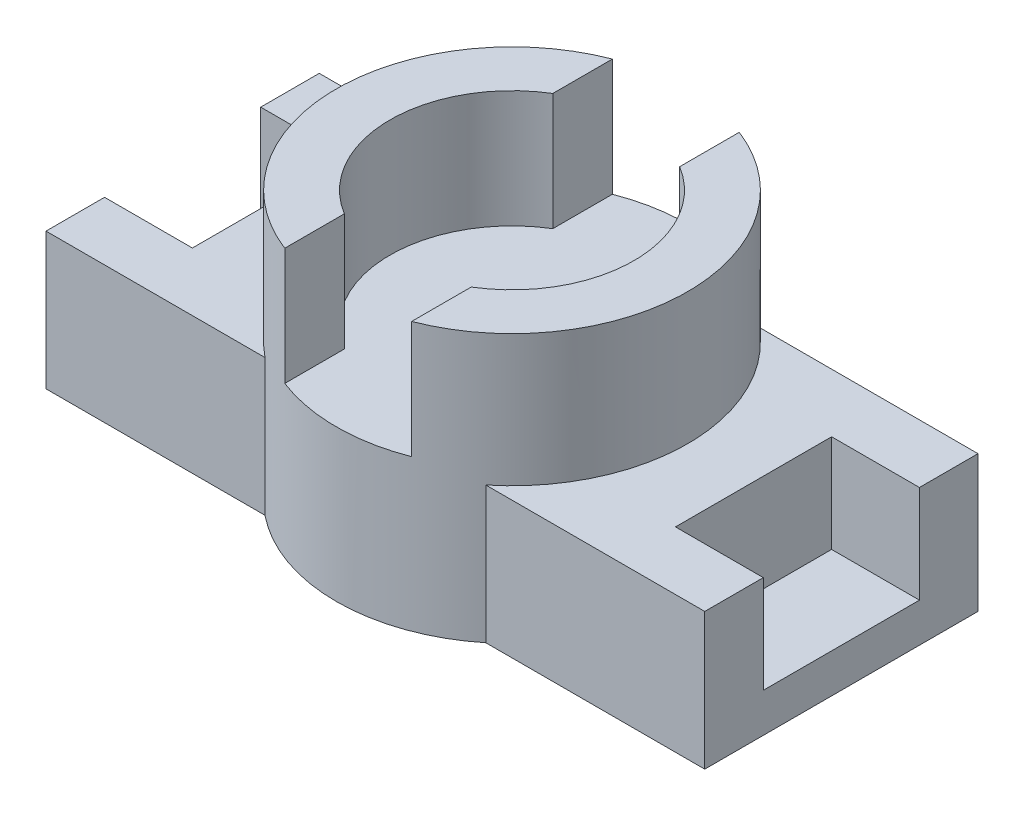
ISO-10303-21;
HEADER;
FILE_DESCRIPTION(('STEP AP214'),'2;1');
FILE_NAME('part.step','',(''),(''),'','','');
FILE_SCHEMA(('AUTOMOTIVE_DESIGN { 1 0 10303 214 1 1 1 1 }'));
ENDSEC;
DATA;
#1=APPLICATION_CONTEXT('core data for automotive mechanical design processes');
#2=APPLICATION_PROTOCOL_DEFINITION('international standard','automotive_design',2000,#1);
#3=PRODUCT_CONTEXT('',#1,'mechanical');
#4=PRODUCT('Part','Part','',(#3));
#5=PRODUCT_RELATED_PRODUCT_CATEGORY('part','',(#4));
#6=PRODUCT_DEFINITION_FORMATION('','',#4);
#7=PRODUCT_DEFINITION_CONTEXT('part definition',#1,'design');
#8=PRODUCT_DEFINITION('design','',#6,#7);
#9=PRODUCT_DEFINITION_SHAPE('','',#8);
#10=(LENGTH_UNIT() NAMED_UNIT(*) SI_UNIT(.MILLI.,.METRE.));
#11=(NAMED_UNIT(*) PLANE_ANGLE_UNIT() SI_UNIT($,.RADIAN.));
#12=(NAMED_UNIT(*) SI_UNIT($,.STERADIAN.) SOLID_ANGLE_UNIT());
#13=UNCERTAINTY_MEASURE_WITH_UNIT(LENGTH_MEASURE(1.E-05),#10,'distance_accuracy_value','');
#14=(GEOMETRIC_REPRESENTATION_CONTEXT(3) GLOBAL_UNCERTAINTY_ASSIGNED_CONTEXT((#13)) GLOBAL_UNIT_ASSIGNED_CONTEXT((#10,
#11,#12)) REPRESENTATION_CONTEXT('',''));
#15=CARTESIAN_POINT('',(0.,0.,0.));
#16=DIRECTION('',(0.,0.,1.));
#17=DIRECTION('',(1.,0.,0.));
#18=AXIS2_PLACEMENT_3D('',#15,#16,#17);
#19=CARTESIAN_POINT('',(0.,55.,0.));
#20=DIRECTION('',(0.,1.,0.));
#21=DIRECTION('',(0.,0.,1.));
#22=AXIS2_PLACEMENT_3D('',#19,#20,#21);
#23=PLANE('',#22);
#24=DIRECTION('',(0.,0.,-1.));
#25=VECTOR('',#24,1.);
#26=CARTESIAN_POINT('',(13.,55.,-33.570820663189));
#27=LINE('',#26,#25);
#28=CARTESIAN_POINT('',(13.,55.,-21.3541565040626));
#29=VERTEX_POINT('',#28);
#30=CARTESIAN_POINT('',(13.,55.,-33.570820663189));
#31=VERTEX_POINT('',#30);
#32=EDGE_CURVE('E212',#29,#31,#27,.T.);
#33=ORIENTED_EDGE('',*,*,#32,.F.);
#34=CARTESIAN_POINT('',(0.,55.,0.));
#35=DIRECTION('',(0.,1.,0.));
#36=DIRECTION('',(0.,0.,1.));
#37=AXIS2_PLACEMENT_3D('',#34,#35,#36);
#38=CIRCLE('',#37,25.);
#39=CARTESIAN_POINT('',(13.,55.,21.3541565040626));
#40=VERTEX_POINT('',#39);
#41=EDGE_CURVE('E402',#40,#29,#38,.T.);
#42=ORIENTED_EDGE('',*,*,#41,.F.);
#43=DIRECTION('',(0.,0.,-1.));
#44=VECTOR('',#43,1.);
#45=CARTESIAN_POINT('',(13.,55.,21.3541565040626));
#46=LINE('',#45,#44);
#47=CARTESIAN_POINT('',(13.,55.,33.570820663189));
#48=VERTEX_POINT('',#47);
#49=EDGE_CURVE('E399',#48,#40,#46,.T.);
#50=ORIENTED_EDGE('',*,*,#49,.F.);
#51=CARTESIAN_POINT('',(0.,55.,0.));
#52=DIRECTION('',(0.,1.,0.));
#53=DIRECTION('',(0.,0.,1.));
#54=AXIS2_PLACEMENT_3D('',#51,#52,#53);
#55=CIRCLE('',#54,36.);
#56=EDGE_CURVE('E282',#48,#31,#55,.T.);
#57=ORIENTED_EDGE('',*,*,#56,.T.);
#58=EDGE_LOOP('',(#33,#42,#50,#57));
#59=FACE_BOUND('',#58,.T.);
#60=ADVANCED_FACE('F33',(#59),#23,.T.);
#61=CARTESIAN_POINT('',(67.5,28.,28.));
#62=DIRECTION('',(-1.,0.,0.));
#63=DIRECTION('',(0.,0.,1.));
#64=AXIS2_PLACEMENT_3D('',#61,#62,#63);
#65=PLANE('',#64);
#66=DIRECTION('',(0.,1.,0.));
#67=VECTOR('',#66,1.);
#68=CARTESIAN_POINT('',(67.5,8.,16.));
#69=LINE('',#68,#67);
#70=CARTESIAN_POINT('',(67.5,8.,16.));
#71=VERTEX_POINT('',#70);
#72=CARTESIAN_POINT('',(67.5,28.,16.));
#73=VERTEX_POINT('',#72);
#74=EDGE_CURVE('E245',#71,#73,#69,.T.);
#75=ORIENTED_EDGE('',*,*,#74,.T.);
#76=DIRECTION('',(0.,0.,-1.));
#77=VECTOR('',#76,1.);
#78=CARTESIAN_POINT('',(67.5,28.,28.));
#79=LINE('',#78,#77);
#80=CARTESIAN_POINT('',(67.5,28.,28.));
#81=VERTEX_POINT('',#80);
#82=EDGE_CURVE('E305',#81,#73,#79,.T.);
#83=ORIENTED_EDGE('',*,*,#82,.F.);
#84=DIRECTION('',(0.,-1.,0.));
#85=VECTOR('',#84,1.);
#86=CARTESIAN_POINT('',(67.5,28.,28.));
#87=LINE('',#86,#85);
#88=CARTESIAN_POINT('',(67.5,0.,28.));
#89=VERTEX_POINT('',#88);
#90=EDGE_CURVE('E320',#81,#89,#87,.T.);
#91=ORIENTED_EDGE('',*,*,#90,.T.);
#92=DIRECTION('',(0.,0.,-1.));
#93=VECTOR('',#92,1.);
#94=CARTESIAN_POINT('',(67.5,0.,28.));
#95=LINE('',#94,#93);
#96=CARTESIAN_POINT('',(67.5,0.,-28.));
#97=VERTEX_POINT('',#96);
#98=EDGE_CURVE('E304',#89,#97,#95,.T.);
#99=ORIENTED_EDGE('',*,*,#98,.T.);
#100=DIRECTION('',(0.,-1.,0.));
#101=VECTOR('',#100,1.);
#102=CARTESIAN_POINT('',(67.5,28.,-28.));
#103=LINE('',#102,#101);
#104=CARTESIAN_POINT('',(67.5,28.,-28.));
#105=VERTEX_POINT('',#104);
#106=EDGE_CURVE('E11',#105,#97,#103,.T.);
#107=ORIENTED_EDGE('',*,*,#106,.F.);
#108=CARTESIAN_POINT('',(67.5,28.,-16.));
#109=VERTEX_POINT('',#108);
#110=EDGE_CURVE('E309',#109,#105,#79,.T.);
#111=ORIENTED_EDGE('',*,*,#110,.F.);
#112=DIRECTION('',(0.,1.,0.));
#113=VECTOR('',#112,1.);
#114=CARTESIAN_POINT('',(67.5,8.,-16.));
#115=LINE('',#114,#113);
#116=CARTESIAN_POINT('',(67.5,8.,-16.));
#117=VERTEX_POINT('',#116);
#118=EDGE_CURVE('E56',#117,#109,#115,.T.);
#119=ORIENTED_EDGE('',*,*,#118,.F.);
#120=DIRECTION('',(0.,0.,1.));
#121=VECTOR('',#120,1.);
#122=CARTESIAN_POINT('',(67.5,8.,16.));
#123=LINE('',#122,#121);
#124=EDGE_CURVE('E227',#117,#71,#123,.T.);
#125=ORIENTED_EDGE('',*,*,#124,.T.);
#126=EDGE_LOOP('',(#75,#83,#91,#99,#107,#111,#119,#125));
#127=FACE_BOUND('',#126,.T.);
#128=ADVANCED_FACE('F35',(#127),#65,.F.);
#129=CARTESIAN_POINT('',(0.,28.,0.));
#130=DIRECTION('',(0.,-1.,0.));
#131=DIRECTION('',(0.,0.,-1.));
#132=AXIS2_PLACEMENT_3D('',#129,#130,#131);
#133=PLANE('',#132);
#134=DIRECTION('',(-1.,0.,0.));
#135=VECTOR('',#134,1.);
#136=CARTESIAN_POINT('',(49.5,28.,16.));
#137=LINE('',#136,#135);
#138=CARTESIAN_POINT('',(49.5,28.,16.));
#139=VERTEX_POINT('',#138);
#140=EDGE_CURVE('E231',#73,#139,#137,.T.);
#141=ORIENTED_EDGE('',*,*,#140,.T.);
#142=DIRECTION('',(0.,0.,-1.));
#143=VECTOR('',#142,1.);
#144=CARTESIAN_POINT('',(49.5,28.,16.));
#145=LINE('',#144,#143);
#146=CARTESIAN_POINT('',(49.5,28.,-16.));
#147=VERTEX_POINT('',#146);
#148=EDGE_CURVE('E239',#139,#147,#145,.T.);
#149=ORIENTED_EDGE('',*,*,#148,.T.);
#150=DIRECTION('',(1.,0.,0.));
#151=VECTOR('',#150,1.);
#152=CARTESIAN_POINT('',(49.5,28.,-16.));
#153=LINE('',#152,#151);
#154=EDGE_CURVE('E237',#147,#109,#153,.T.);
#155=ORIENTED_EDGE('',*,*,#154,.T.);
#156=ORIENTED_EDGE('',*,*,#110,.T.);
#157=DIRECTION('',(-1.,0.,0.));
#158=VECTOR('',#157,1.);
#159=CARTESIAN_POINT('',(-67.5,28.,-28.));
#160=LINE('',#159,#158);
#161=CARTESIAN_POINT('',(22.6274169979695,28.,-28.));
#162=VERTEX_POINT('',#161);
#163=EDGE_CURVE('E310',#105,#162,#160,.T.);
#164=ORIENTED_EDGE('',*,*,#163,.T.);
#165=CARTESIAN_POINT('',(0.,28.,0.));
#166=DIRECTION('',(0.,-1.,0.));
#167=DIRECTION('',(0.,0.,-1.));
#168=AXIS2_PLACEMENT_3D('',#165,#166,#167);
#169=CIRCLE('',#168,36.);
#170=CARTESIAN_POINT('',(22.6274169979695,28.,28.));
#171=VERTEX_POINT('',#170);
#172=EDGE_CURVE('E285',#171,#162,#169,.F.);
#173=ORIENTED_EDGE('',*,*,#172,.F.);
#174=DIRECTION('',(1.,0.,0.));
#175=VECTOR('',#174,1.);
#176=CARTESIAN_POINT('',(-67.5,28.,28.));
#177=LINE('',#176,#175);
#178=EDGE_CURVE('E316',#171,#81,#177,.T.);
#179=ORIENTED_EDGE('',*,*,#178,.T.);
#180=ORIENTED_EDGE('',*,*,#82,.T.);
#181=EDGE_LOOP('',(#141,#149,#155,#156,#164,#173,#179,#180));
#182=FACE_BOUND('',#181,.T.);
#183=ADVANCED_FACE('F362',(#182),#133,.F.);
#184=CARTESIAN_POINT('',(-67.5,28.,-28.));
#185=DIRECTION('',(0.,0.,1.));
#186=DIRECTION('',(1.,0.,0.));
#187=AXIS2_PLACEMENT_3D('',#184,#185,#186);
#188=PLANE('',#187);
#189=DIRECTION('',(0.,-1.,0.));
#190=VECTOR('',#189,1.);
#191=CARTESIAN_POINT('',(-22.6274169979695,55.,-28.));
#192=LINE('',#191,#190);
#193=CARTESIAN_POINT('',(-22.6274169979695,0.,-28.));
#194=VERTEX_POINT('',#193);
#195=CARTESIAN_POINT('',(-22.6274169979695,28.,-28.));
#196=VERTEX_POINT('',#195);
#197=EDGE_CURVE('E301',#194,#196,#192,.F.);
#198=ORIENTED_EDGE('',*,*,#197,.F.);
#199=DIRECTION('',(-1.,0.,0.));
#200=VECTOR('',#199,1.);
#201=CARTESIAN_POINT('',(-67.5,0.,-28.));
#202=LINE('',#201,#200);
#203=CARTESIAN_POINT('',(-67.5,0.,-28.));
#204=VERTEX_POINT('',#203);
#205=EDGE_CURVE('E323',#194,#204,#202,.T.);
#206=ORIENTED_EDGE('',*,*,#205,.T.);
#207=DIRECTION('',(0.,-1.,0.));
#208=VECTOR('',#207,1.);
#209=CARTESIAN_POINT('',(-67.5,28.,-28.));
#210=LINE('',#209,#208);
#211=CARTESIAN_POINT('',(-67.5,28.,-28.));
#212=VERTEX_POINT('',#211);
#213=EDGE_CURVE('E41',#212,#204,#210,.T.);
#214=ORIENTED_EDGE('',*,*,#213,.F.);
#215=EDGE_CURVE('E308',#196,#212,#160,.T.);
#216=ORIENTED_EDGE('',*,*,#215,.F.);
#217=EDGE_LOOP('',(#198,#206,#214,#216));
#218=FACE_BOUND('',#217,.T.);
#219=ADVANCED_FACE('F359',(#218),#188,.F.);
#220=DIRECTION('',(0.,-1.,0.));
#221=VECTOR('',#220,1.);
#222=CARTESIAN_POINT('',(22.6274169979695,55.,-28.));
#223=LINE('',#222,#221);
#224=CARTESIAN_POINT('',(22.6274169979695,0.,-28.));
#225=VERTEX_POINT('',#224);
#226=EDGE_CURVE('E295',#162,#225,#223,.T.);
#227=ORIENTED_EDGE('',*,*,#226,.F.);
#228=ORIENTED_EDGE('',*,*,#163,.F.);
#229=ORIENTED_EDGE('',*,*,#106,.T.);
#230=EDGE_CURVE('E324',#97,#225,#202,.T.);
#231=ORIENTED_EDGE('',*,*,#230,.T.);
#232=EDGE_LOOP('',(#227,#228,#229,#231));
#233=FACE_BOUND('',#232,.T.);
#234=ADVANCED_FACE('F361',(#233),#188,.F.);
#235=CARTESIAN_POINT('',(-67.5,28.,28.));
#236=DIRECTION('',(0.,0.,-1.));
#237=DIRECTION('',(-1.,0.,0.));
#238=AXIS2_PLACEMENT_3D('',#235,#236,#237);
#239=PLANE('',#238);
#240=DIRECTION('',(0.,-1.,0.));
#241=VECTOR('',#240,1.);
#242=CARTESIAN_POINT('',(22.6274169979695,55.,28.));
#243=LINE('',#242,#241);
#244=CARTESIAN_POINT('',(22.6274169979695,0.,28.));
#245=VERTEX_POINT('',#244);
#246=EDGE_CURVE('E291',#245,#171,#243,.F.);
#247=ORIENTED_EDGE('',*,*,#246,.F.);
#248=DIRECTION('',(1.,0.,0.));
#249=VECTOR('',#248,1.);
#250=CARTESIAN_POINT('',(-67.5,0.,28.));
#251=LINE('',#250,#249);
#252=EDGE_CURVE('E328',#245,#89,#251,.T.);
#253=ORIENTED_EDGE('',*,*,#252,.T.);
#254=ORIENTED_EDGE('',*,*,#90,.F.);
#255=ORIENTED_EDGE('',*,*,#178,.F.);
#256=EDGE_LOOP('',(#247,#253,#254,#255));
#257=FACE_BOUND('',#256,.T.);
#258=ADVANCED_FACE('F367',(#257),#239,.F.);
#259=DIRECTION('',(0.,-1.,0.));
#260=VECTOR('',#259,1.);
#261=CARTESIAN_POINT('',(-22.6274169979695,55.,28.));
#262=LINE('',#261,#260);
#263=CARTESIAN_POINT('',(-22.6274169979695,28.,28.));
#264=VERTEX_POINT('',#263);
#265=CARTESIAN_POINT('',(-22.6274169979695,0.,28.));
#266=VERTEX_POINT('',#265);
#267=EDGE_CURVE('E298',#264,#266,#262,.T.);
#268=ORIENTED_EDGE('',*,*,#267,.F.);
#269=CARTESIAN_POINT('',(-67.5,28.,28.));
#270=VERTEX_POINT('',#269);
#271=EDGE_CURVE('E317',#270,#264,#177,.T.);
#272=ORIENTED_EDGE('',*,*,#271,.F.);
#273=DIRECTION('',(0.,-1.,0.));
#274=VECTOR('',#273,1.);
#275=CARTESIAN_POINT('',(-67.5,28.,28.));
#276=LINE('',#275,#274);
#277=CARTESIAN_POINT('',(-67.5,0.,28.));
#278=VERTEX_POINT('',#277);
#279=EDGE_CURVE('E333',#270,#278,#276,.T.);
#280=ORIENTED_EDGE('',*,*,#279,.T.);
#281=EDGE_CURVE('E329',#278,#266,#251,.T.);
#282=ORIENTED_EDGE('',*,*,#281,.T.);
#283=EDGE_LOOP('',(#268,#272,#280,#282));
#284=FACE_BOUND('',#283,.T.);
#285=ADVANCED_FACE('F354',(#284),#239,.F.);
#286=DIRECTION('',(0.,0.,1.));
#287=VECTOR('',#286,1.);
#288=CARTESIAN_POINT('',(-67.5,28.,28.));
#289=LINE('',#288,#287);
#290=CARTESIAN_POINT('',(-67.5,28.,-16.));
#291=VERTEX_POINT('',#290);
#292=EDGE_CURVE('E313',#212,#291,#289,.T.);
#293=ORIENTED_EDGE('',*,*,#292,.T.);
#294=DIRECTION('',(-1.,0.,0.));
#295=VECTOR('',#294,1.);
#296=CARTESIAN_POINT('',(-49.5,28.,-16.));
#297=LINE('',#296,#295);
#298=CARTESIAN_POINT('',(-49.5,28.,-16.));
#299=VERTEX_POINT('',#298);
#300=EDGE_CURVE('E258',#299,#291,#297,.T.);
#301=ORIENTED_EDGE('',*,*,#300,.F.);
#302=DIRECTION('',(0.,0.,-1.));
#303=VECTOR('',#302,1.);
#304=CARTESIAN_POINT('',(-49.5,28.,16.));
#305=LINE('',#304,#303);
#306=CARTESIAN_POINT('',(-49.5,28.,16.));
#307=VERTEX_POINT('',#306);
#308=EDGE_CURVE('E269',#307,#299,#305,.T.);
#309=ORIENTED_EDGE('',*,*,#308,.F.);
#310=DIRECTION('',(1.,0.,0.));
#311=VECTOR('',#310,1.);
#312=CARTESIAN_POINT('',(-49.5,28.,16.));
#313=LINE('',#312,#311);
#314=CARTESIAN_POINT('',(-67.5,28.,16.));
#315=VERTEX_POINT('',#314);
#316=EDGE_CURVE('E248',#315,#307,#313,.T.);
#317=ORIENTED_EDGE('',*,*,#316,.F.);
#318=EDGE_CURVE('E312',#315,#270,#289,.T.);
#319=ORIENTED_EDGE('',*,*,#318,.T.);
#320=ORIENTED_EDGE('',*,*,#271,.T.);
#321=EDGE_CURVE('E292',#196,#264,#169,.F.);
#322=ORIENTED_EDGE('',*,*,#321,.F.);
#323=ORIENTED_EDGE('',*,*,#215,.T.);
#324=EDGE_LOOP('',(#293,#301,#309,#317,#319,#320,#322,#323));
#325=FACE_BOUND('',#324,.T.);
#326=ADVANCED_FACE('F358',(#325),#133,.F.);
#327=CARTESIAN_POINT('',(-67.5,28.,28.));
#328=DIRECTION('',(1.,0.,0.));
#329=DIRECTION('',(0.,0.,-1.));
#330=AXIS2_PLACEMENT_3D('',#327,#328,#329);
#331=PLANE('',#330);
#332=DIRECTION('',(0.,0.,1.));
#333=VECTOR('',#332,1.);
#334=CARTESIAN_POINT('',(-67.5,8.,16.));
#335=LINE('',#334,#333);
#336=CARTESIAN_POINT('',(-67.5,8.,-16.));
#337=VERTEX_POINT('',#336);
#338=CARTESIAN_POINT('',(-67.5,8.,16.));
#339=VERTEX_POINT('',#338);
#340=EDGE_CURVE('E254',#337,#339,#335,.T.);
#341=ORIENTED_EDGE('',*,*,#340,.F.);
#342=DIRECTION('',(0.,1.,0.));
#343=VECTOR('',#342,1.);
#344=CARTESIAN_POINT('',(-67.5,8.,-16.));
#345=LINE('',#344,#343);
#346=EDGE_CURVE('E273',#337,#291,#345,.T.);
#347=ORIENTED_EDGE('',*,*,#346,.T.);
#348=ORIENTED_EDGE('',*,*,#292,.F.);
#349=ORIENTED_EDGE('',*,*,#213,.T.);
#350=DIRECTION('',(0.,0.,1.));
#351=VECTOR('',#350,1.);
#352=CARTESIAN_POINT('',(-67.5,0.,28.));
#353=LINE('',#352,#351);
#354=EDGE_CURVE('E326',#204,#278,#353,.T.);
#355=ORIENTED_EDGE('',*,*,#354,.T.);
#356=ORIENTED_EDGE('',*,*,#279,.F.);
#357=ORIENTED_EDGE('',*,*,#318,.F.);
#358=DIRECTION('',(0.,1.,0.));
#359=VECTOR('',#358,1.);
#360=CARTESIAN_POINT('',(-67.5,8.,16.));
#361=LINE('',#360,#359);
#362=EDGE_CURVE('E266',#339,#315,#361,.T.);
#363=ORIENTED_EDGE('',*,*,#362,.F.);
#364=EDGE_LOOP('',(#341,#347,#348,#349,#355,#356,#357,#363));
#365=FACE_BOUND('',#364,.T.);
#366=ADVANCED_FACE('F341',(#365),#331,.F.);
#367=CARTESIAN_POINT('',(0.,0.,0.));
#368=DIRECTION('',(0.,-1.,0.));
#369=DIRECTION('',(0.,0.,-1.));
#370=AXIS2_PLACEMENT_3D('',#367,#368,#369);
#371=PLANE('',#370);
#372=ORIENTED_EDGE('',*,*,#252,.F.);
#373=CARTESIAN_POINT('',(0.,0.,0.));
#374=DIRECTION('',(0.,1.,0.));
#375=DIRECTION('',(0.,0.,1.));
#376=AXIS2_PLACEMENT_3D('',#373,#374,#375);
#377=CIRCLE('',#376,36.);
#378=EDGE_CURVE('E276',#266,#245,#377,.T.);
#379=ORIENTED_EDGE('',*,*,#378,.F.);
#380=ORIENTED_EDGE('',*,*,#281,.F.);
#381=ORIENTED_EDGE('',*,*,#354,.F.);
#382=ORIENTED_EDGE('',*,*,#205,.F.);
#383=EDGE_CURVE('E288',#225,#194,#377,.T.);
#384=ORIENTED_EDGE('',*,*,#383,.F.);
#385=ORIENTED_EDGE('',*,*,#230,.F.);
#386=ORIENTED_EDGE('',*,*,#98,.F.);
#387=EDGE_LOOP('',(#372,#379,#380,#381,#382,#384,#385,#386));
#388=FACE_BOUND('',#387,.T.);
#389=ADVANCED_FACE('F349',(#388),#371,.T.);
#390=CARTESIAN_POINT('',(0.,55.,0.));
#391=DIRECTION('',(0.,-1.,0.));
#392=DIRECTION('',(0.,0.,-1.));
#393=AXIS2_PLACEMENT_3D('',#390,#391,#392);
#394=CYLINDRICAL_SURFACE('',#393,36.);
#395=CARTESIAN_POINT('',(0.,31.,0.));
#396=DIRECTION('',(0.,1.,0.));
#397=DIRECTION('',(0.,0.,1.));
#398=AXIS2_PLACEMENT_3D('',#395,#396,#397);
#399=CIRCLE('',#398,36.);
#400=CARTESIAN_POINT('',(13.,31.,-33.570820663189));
#401=VERTEX_POINT('',#400);
#402=CARTESIAN_POINT('',(-13.,31.,-33.570820663189));
#403=VERTEX_POINT('',#402);
#404=EDGE_CURVE('E202',#401,#403,#399,.T.);
#405=ORIENTED_EDGE('',*,*,#404,.F.);
#406=DIRECTION('',(0.,1.,0.));
#407=VECTOR('',#406,1.);
#408=CARTESIAN_POINT('',(13.,31.,-33.570820663189));
#409=LINE('',#408,#407);
#410=EDGE_CURVE('E240',#401,#31,#409,.T.);
#411=ORIENTED_EDGE('',*,*,#410,.T.);
#412=ORIENTED_EDGE('',*,*,#56,.F.);
#413=DIRECTION('',(0.,1.,0.));
#414=VECTOR('',#413,1.);
#415=CARTESIAN_POINT('',(13.,31.,33.570820663189));
#416=LINE('',#415,#414);
#417=CARTESIAN_POINT('',(13.,31.,33.570820663189));
#418=VERTEX_POINT('',#417);
#419=EDGE_CURVE('E416',#418,#48,#416,.T.);
#420=ORIENTED_EDGE('',*,*,#419,.F.);
#421=CARTESIAN_POINT('',(0.,31.,0.));
#422=DIRECTION('',(0.,1.,0.));
#423=DIRECTION('',(0.,0.,1.));
#424=AXIS2_PLACEMENT_3D('',#421,#422,#423);
#425=CIRCLE('',#424,36.);
#426=CARTESIAN_POINT('',(-13.,31.,33.5708206631891));
#427=VERTEX_POINT('',#426);
#428=EDGE_CURVE('E430',#427,#418,#425,.T.);
#429=ORIENTED_EDGE('',*,*,#428,.F.);
#430=DIRECTION('',(0.,1.,0.));
#431=VECTOR('',#430,1.);
#432=CARTESIAN_POINT('',(-13.,31.,33.5708206631891));
#433=LINE('',#432,#431);
#434=CARTESIAN_POINT('',(-13.,55.,33.5708206631891));
#435=VERTEX_POINT('',#434);
#436=EDGE_CURVE('E418',#427,#435,#433,.T.);
#437=ORIENTED_EDGE('',*,*,#436,.T.);
#438=CARTESIAN_POINT('',(-13.,55.,-33.570820663189));
#439=VERTEX_POINT('',#438);
#440=EDGE_CURVE('E219',#439,#435,#55,.T.);
#441=ORIENTED_EDGE('',*,*,#440,.F.);
#442=DIRECTION('',(0.,1.,0.));
#443=VECTOR('',#442,1.);
#444=CARTESIAN_POINT('',(-13.,31.,-33.570820663189));
#445=LINE('',#444,#443);
#446=EDGE_CURVE('E48',#403,#439,#445,.T.);
#447=ORIENTED_EDGE('',*,*,#446,.F.);
#448=EDGE_LOOP('',(#405,#411,#412,#420,#429,#437,#441,#447));
#449=FACE_BOUND('',#448,.T.);
#450=ORIENTED_EDGE('',*,*,#383,.T.);
#451=ORIENTED_EDGE('',*,*,#197,.T.);
#452=ORIENTED_EDGE('',*,*,#321,.T.);
#453=ORIENTED_EDGE('',*,*,#267,.T.);
#454=ORIENTED_EDGE('',*,*,#378,.T.);
#455=ORIENTED_EDGE('',*,*,#246,.T.);
#456=ORIENTED_EDGE('',*,*,#172,.T.);
#457=ORIENTED_EDGE('',*,*,#226,.T.);
#458=EDGE_LOOP('',(#450,#451,#452,#453,#454,#455,#456,#457));
#459=FACE_BOUND('',#458,.T.);
#460=ADVANCED_FACE('F215',(#449,#459),#394,.T.);
#461=DIRECTION('',(0.,0.,1.));
#462=VECTOR('',#461,1.);
#463=CARTESIAN_POINT('',(-13.,55.,21.3541565040626));
#464=LINE('',#463,#462);
#465=CARTESIAN_POINT('',(-13.,55.,21.3541565040626));
#466=VERTEX_POINT('',#465);
#467=EDGE_CURVE('E395',#466,#435,#464,.T.);
#468=ORIENTED_EDGE('',*,*,#467,.F.);
#469=CARTESIAN_POINT('',(0.,55.,0.));
#470=DIRECTION('',(0.,1.,0.));
#471=DIRECTION('',(0.,0.,1.));
#472=AXIS2_PLACEMENT_3D('',#469,#470,#471);
#473=CIRCLE('',#472,25.);
#474=CARTESIAN_POINT('',(-13.,55.,-21.3541565040626));
#475=VERTEX_POINT('',#474);
#476=EDGE_CURVE('E397',#475,#466,#473,.T.);
#477=ORIENTED_EDGE('',*,*,#476,.F.);
#478=DIRECTION('',(0.,0.,1.));
#479=VECTOR('',#478,1.);
#480=CARTESIAN_POINT('',(-13.,55.,-33.570820663189));
#481=LINE('',#480,#479);
#482=EDGE_CURVE('E404',#439,#475,#481,.T.);
#483=ORIENTED_EDGE('',*,*,#482,.F.);
#484=ORIENTED_EDGE('',*,*,#440,.T.);
#485=EDGE_LOOP('',(#468,#477,#483,#484));
#486=FACE_BOUND('',#485,.T.);
#487=ADVANCED_FACE('F375',(#486),#23,.T.);
#488=CARTESIAN_POINT('',(-49.5,8.,-16.));
#489=DIRECTION('',(0.,0.,-1.));
#490=DIRECTION('',(-1.,0.,0.));
#491=AXIS2_PLACEMENT_3D('',#488,#489,#490);
#492=PLANE('',#491);
#493=ORIENTED_EDGE('',*,*,#300,.T.);
#494=ORIENTED_EDGE('',*,*,#346,.F.);
#495=DIRECTION('',(-1.,0.,0.));
#496=VECTOR('',#495,1.);
#497=CARTESIAN_POINT('',(-49.5,8.,-16.));
#498=LINE('',#497,#496);
#499=CARTESIAN_POINT('',(-49.5,8.,-16.));
#500=VERTEX_POINT('',#499);
#501=EDGE_CURVE('E264',#500,#337,#498,.T.);
#502=ORIENTED_EDGE('',*,*,#501,.F.);
#503=DIRECTION('',(0.,1.,0.));
#504=VECTOR('',#503,1.);
#505=CARTESIAN_POINT('',(-49.5,8.,-16.));
#506=LINE('',#505,#504);
#507=EDGE_CURVE('E277',#500,#299,#506,.T.);
#508=ORIENTED_EDGE('',*,*,#507,.T.);
#509=EDGE_LOOP('',(#493,#494,#502,#508));
#510=FACE_BOUND('',#509,.T.);
#511=ADVANCED_FACE('F384',(#510),#492,.F.);
#512=CARTESIAN_POINT('',(-49.5,8.,16.));
#513=DIRECTION('',(1.,0.,0.));
#514=DIRECTION('',(0.,0.,-1.));
#515=AXIS2_PLACEMENT_3D('',#512,#513,#514);
#516=PLANE('',#515);
#517=ORIENTED_EDGE('',*,*,#308,.T.);
#518=ORIENTED_EDGE('',*,*,#507,.F.);
#519=DIRECTION('',(0.,0.,-1.));
#520=VECTOR('',#519,1.);
#521=CARTESIAN_POINT('',(-49.5,8.,16.));
#522=LINE('',#521,#520);
#523=CARTESIAN_POINT('',(-49.5,8.,16.));
#524=VERTEX_POINT('',#523);
#525=EDGE_CURVE('E261',#524,#500,#522,.T.);
#526=ORIENTED_EDGE('',*,*,#525,.F.);
#527=DIRECTION('',(0.,1.,0.));
#528=VECTOR('',#527,1.);
#529=CARTESIAN_POINT('',(-49.5,8.,16.));
#530=LINE('',#529,#528);
#531=EDGE_CURVE('E279',#524,#307,#530,.T.);
#532=ORIENTED_EDGE('',*,*,#531,.T.);
#533=EDGE_LOOP('',(#517,#518,#526,#532));
#534=FACE_BOUND('',#533,.T.);
#535=ADVANCED_FACE('F390',(#534),#516,.F.);
#536=CARTESIAN_POINT('',(-49.5,8.,16.));
#537=DIRECTION('',(0.,0.,1.));
#538=DIRECTION('',(1.,0.,0.));
#539=AXIS2_PLACEMENT_3D('',#536,#537,#538);
#540=PLANE('',#539);
#541=ORIENTED_EDGE('',*,*,#316,.T.);
#542=ORIENTED_EDGE('',*,*,#531,.F.);
#543=DIRECTION('',(1.,0.,0.));
#544=VECTOR('',#543,1.);
#545=CARTESIAN_POINT('',(-49.5,8.,16.));
#546=LINE('',#545,#544);
#547=EDGE_CURVE('E257',#339,#524,#546,.T.);
#548=ORIENTED_EDGE('',*,*,#547,.F.);
#549=ORIENTED_EDGE('',*,*,#362,.T.);
#550=EDGE_LOOP('',(#541,#542,#548,#549));
#551=FACE_BOUND('',#550,.T.);
#552=ADVANCED_FACE('F479',(#551),#540,.F.);
#553=CARTESIAN_POINT('',(0.,8.,0.));
#554=DIRECTION('',(0.,1.,0.));
#555=DIRECTION('',(0.,0.,1.));
#556=AXIS2_PLACEMENT_3D('',#553,#554,#555);
#557=PLANE('',#556);
#558=ORIENTED_EDGE('',*,*,#340,.T.);
#559=ORIENTED_EDGE('',*,*,#547,.T.);
#560=ORIENTED_EDGE('',*,*,#525,.T.);
#561=ORIENTED_EDGE('',*,*,#501,.T.);
#562=EDGE_LOOP('',(#558,#559,#560,#561));
#563=FACE_BOUND('',#562,.T.);
#564=ADVANCED_FACE('F471',(#563),#557,.T.);
#565=CARTESIAN_POINT('',(49.5,8.,16.));
#566=DIRECTION('',(0.,0.,-1.));
#567=DIRECTION('',(-1.,0.,0.));
#568=AXIS2_PLACEMENT_3D('',#565,#566,#567);
#569=PLANE('',#568);
#570=ORIENTED_EDGE('',*,*,#140,.F.);
#571=ORIENTED_EDGE('',*,*,#74,.F.);
#572=DIRECTION('',(-1.,0.,0.));
#573=VECTOR('',#572,1.);
#574=CARTESIAN_POINT('',(49.5,8.,16.));
#575=LINE('',#574,#573);
#576=CARTESIAN_POINT('',(49.5,8.,16.));
#577=VERTEX_POINT('',#576);
#578=EDGE_CURVE('E235',#71,#577,#575,.T.);
#579=ORIENTED_EDGE('',*,*,#578,.T.);
#580=DIRECTION('',(0.,1.,0.));
#581=VECTOR('',#580,1.);
#582=CARTESIAN_POINT('',(49.5,8.,16.));
#583=LINE('',#582,#581);
#584=EDGE_CURVE('E249',#577,#139,#583,.T.);
#585=ORIENTED_EDGE('',*,*,#584,.T.);
#586=EDGE_LOOP('',(#570,#571,#579,#585));
#587=FACE_BOUND('',#586,.T.);
#588=ADVANCED_FACE('F467',(#587),#569,.T.);
#589=CARTESIAN_POINT('',(49.5,8.,16.));
#590=DIRECTION('',(1.,0.,0.));
#591=DIRECTION('',(0.,0.,-1.));
#592=AXIS2_PLACEMENT_3D('',#589,#590,#591);
#593=PLANE('',#592);
#594=ORIENTED_EDGE('',*,*,#148,.F.);
#595=ORIENTED_EDGE('',*,*,#584,.F.);
#596=DIRECTION('',(0.,0.,-1.));
#597=VECTOR('',#596,1.);
#598=CARTESIAN_POINT('',(49.5,8.,16.));
#599=LINE('',#598,#597);
#600=CARTESIAN_POINT('',(49.5,8.,-16.));
#601=VERTEX_POINT('',#600);
#602=EDGE_CURVE('E233',#577,#601,#599,.T.);
#603=ORIENTED_EDGE('',*,*,#602,.T.);
#604=DIRECTION('',(0.,1.,0.));
#605=VECTOR('',#604,1.);
#606=CARTESIAN_POINT('',(49.5,8.,-16.));
#607=LINE('',#606,#605);
#608=EDGE_CURVE('E251',#601,#147,#607,.T.);
#609=ORIENTED_EDGE('',*,*,#608,.T.);
#610=EDGE_LOOP('',(#594,#595,#603,#609));
#611=FACE_BOUND('',#610,.T.);
#612=ADVANCED_FACE('F470',(#611),#593,.T.);
#613=CARTESIAN_POINT('',(49.5,8.,-16.));
#614=DIRECTION('',(0.,0.,1.));
#615=DIRECTION('',(1.,0.,0.));
#616=AXIS2_PLACEMENT_3D('',#613,#614,#615);
#617=PLANE('',#616);
#618=ORIENTED_EDGE('',*,*,#154,.F.);
#619=ORIENTED_EDGE('',*,*,#608,.F.);
#620=DIRECTION('',(1.,0.,0.));
#621=VECTOR('',#620,1.);
#622=CARTESIAN_POINT('',(49.5,8.,-16.));
#623=LINE('',#622,#621);
#624=EDGE_CURVE('E230',#601,#117,#623,.T.);
#625=ORIENTED_EDGE('',*,*,#624,.T.);
#626=ORIENTED_EDGE('',*,*,#118,.T.);
#627=EDGE_LOOP('',(#618,#619,#625,#626));
#628=FACE_BOUND('',#627,.T.);
#629=ADVANCED_FACE('F454',(#628),#617,.T.);
#630=CARTESIAN_POINT('',(0.,8.,0.));
#631=DIRECTION('',(0.,1.,0.));
#632=DIRECTION('',(0.,0.,1.));
#633=AXIS2_PLACEMENT_3D('',#630,#631,#632);
#634=PLANE('',#633);
#635=ORIENTED_EDGE('',*,*,#124,.F.);
#636=ORIENTED_EDGE('',*,*,#624,.F.);
#637=ORIENTED_EDGE('',*,*,#602,.F.);
#638=ORIENTED_EDGE('',*,*,#578,.F.);
#639=EDGE_LOOP('',(#635,#636,#637,#638));
#640=FACE_BOUND('',#639,.T.);
#641=ADVANCED_FACE('F447',(#640),#634,.T.);
#642=CARTESIAN_POINT('',(13.,31.,-33.570820663189));
#643=DIRECTION('',(1.,0.,0.));
#644=DIRECTION('',(0.,0.,-1.));
#645=AXIS2_PLACEMENT_3D('',#642,#643,#644);
#646=PLANE('',#645);
#647=ORIENTED_EDGE('',*,*,#32,.T.);
#648=ORIENTED_EDGE('',*,*,#410,.F.);
#649=DIRECTION('',(0.,0.,-1.));
#650=VECTOR('',#649,1.);
#651=CARTESIAN_POINT('',(13.,31.,-33.570820663189));
#652=LINE('',#651,#650);
#653=CARTESIAN_POINT('',(13.,31.,-21.3541565040626));
#654=VERTEX_POINT('',#653);
#655=EDGE_CURVE('E209',#654,#401,#652,.T.);
#656=ORIENTED_EDGE('',*,*,#655,.F.);
#657=DIRECTION('',(0.,1.,0.));
#658=VECTOR('',#657,1.);
#659=CARTESIAN_POINT('',(13.,31.,-21.3541565040626));
#660=LINE('',#659,#658);
#661=EDGE_CURVE('E412',#654,#29,#660,.T.);
#662=ORIENTED_EDGE('',*,*,#661,.T.);
#663=EDGE_LOOP('',(#647,#648,#656,#662));
#664=FACE_BOUND('',#663,.T.);
#665=ADVANCED_FACE('F445',(#664),#646,.F.);
#666=CARTESIAN_POINT('',(0.,31.,0.));
#667=DIRECTION('',(0.,1.,0.));
#668=DIRECTION('',(0.,0.,1.));
#669=AXIS2_PLACEMENT_3D('',#666,#667,#668);
#670=CYLINDRICAL_SURFACE('',#669,25.);
#671=ORIENTED_EDGE('',*,*,#41,.T.);
#672=ORIENTED_EDGE('',*,*,#661,.F.);
#673=CARTESIAN_POINT('',(0.,31.,0.));
#674=DIRECTION('',(0.,1.,0.));
#675=DIRECTION('',(0.,0.,1.));
#676=AXIS2_PLACEMENT_3D('',#673,#674,#675);
#677=CIRCLE('',#676,25.);
#678=CARTESIAN_POINT('',(13.,31.,21.3541565040626));
#679=VERTEX_POINT('',#678);
#680=EDGE_CURVE('E223',#679,#654,#677,.T.);
#681=ORIENTED_EDGE('',*,*,#680,.F.);
#682=DIRECTION('',(0.,1.,0.));
#683=VECTOR('',#682,1.);
#684=CARTESIAN_POINT('',(13.,31.,21.3541565040626));
#685=LINE('',#684,#683);
#686=EDGE_CURVE('E414',#679,#40,#685,.T.);
#687=ORIENTED_EDGE('',*,*,#686,.T.);
#688=EDGE_LOOP('',(#671,#672,#681,#687));
#689=FACE_BOUND('',#688,.T.);
#690=ADVANCED_FACE('F442',(#689),#670,.F.);
#691=CARTESIAN_POINT('',(13.,31.,21.3541565040626));
#692=DIRECTION('',(1.,0.,0.));
#693=DIRECTION('',(0.,0.,-1.));
#694=AXIS2_PLACEMENT_3D('',#691,#692,#693);
#695=PLANE('',#694);
#696=ORIENTED_EDGE('',*,*,#49,.T.);
#697=ORIENTED_EDGE('',*,*,#686,.F.);
#698=DIRECTION('',(0.,0.,-1.));
#699=VECTOR('',#698,1.);
#700=CARTESIAN_POINT('',(13.,31.,21.3541565040626));
#701=LINE('',#700,#699);
#702=EDGE_CURVE('E427',#418,#679,#701,.T.);
#703=ORIENTED_EDGE('',*,*,#702,.F.);
#704=ORIENTED_EDGE('',*,*,#419,.T.);
#705=EDGE_LOOP('',(#696,#697,#703,#704));
#706=FACE_BOUND('',#705,.T.);
#707=ADVANCED_FACE('F439',(#706),#695,.F.);
#708=CARTESIAN_POINT('',(-13.,31.,21.3541565040626));
#709=DIRECTION('',(-1.,0.,0.));
#710=DIRECTION('',(0.,0.,1.));
#711=AXIS2_PLACEMENT_3D('',#708,#709,#710);
#712=PLANE('',#711);
#713=ORIENTED_EDGE('',*,*,#467,.T.);
#714=ORIENTED_EDGE('',*,*,#436,.F.);
#715=DIRECTION('',(0.,0.,1.));
#716=VECTOR('',#715,1.);
#717=CARTESIAN_POINT('',(-13.,31.,21.3541565040626));
#718=LINE('',#717,#716);
#719=CARTESIAN_POINT('',(-13.,31.,21.3541565040626));
#720=VERTEX_POINT('',#719);
#721=EDGE_CURVE('E422',#720,#427,#718,.T.);
#722=ORIENTED_EDGE('',*,*,#721,.F.);
#723=DIRECTION('',(0.,1.,0.));
#724=VECTOR('',#723,1.);
#725=CARTESIAN_POINT('',(-13.,31.,21.3541565040626));
#726=LINE('',#725,#724);
#727=EDGE_CURVE('E221',#720,#466,#726,.T.);
#728=ORIENTED_EDGE('',*,*,#727,.T.);
#729=EDGE_LOOP('',(#713,#714,#722,#728));
#730=FACE_BOUND('',#729,.T.);
#731=ADVANCED_FACE('F420',(#730),#712,.F.);
#732=CARTESIAN_POINT('',(0.,31.,0.));
#733=DIRECTION('',(0.,1.,0.));
#734=DIRECTION('',(0.,0.,1.));
#735=AXIS2_PLACEMENT_3D('',#732,#733,#734);
#736=CYLINDRICAL_SURFACE('',#735,25.);
#737=ORIENTED_EDGE('',*,*,#476,.T.);
#738=ORIENTED_EDGE('',*,*,#727,.F.);
#739=CARTESIAN_POINT('',(0.,31.,0.));
#740=DIRECTION('',(0.,1.,0.));
#741=DIRECTION('',(0.,0.,1.));
#742=AXIS2_PLACEMENT_3D('',#739,#740,#741);
#743=CIRCLE('',#742,25.);
#744=CARTESIAN_POINT('',(-13.,31.,-21.3541565040626));
#745=VERTEX_POINT('',#744);
#746=EDGE_CURVE('E201',#745,#720,#743,.T.);
#747=ORIENTED_EDGE('',*,*,#746,.F.);
#748=DIRECTION('',(0.,1.,0.));
#749=VECTOR('',#748,1.);
#750=CARTESIAN_POINT('',(-13.,31.,-21.3541565040626));
#751=LINE('',#750,#749);
#752=EDGE_CURVE('E197',#745,#475,#751,.T.);
#753=ORIENTED_EDGE('',*,*,#752,.T.);
#754=EDGE_LOOP('',(#737,#738,#747,#753));
#755=FACE_BOUND('',#754,.T.);
#756=ADVANCED_FACE('F424',(#755),#736,.F.);
#757=CARTESIAN_POINT('',(-13.,31.,-33.570820663189));
#758=DIRECTION('',(-1.,0.,0.));
#759=DIRECTION('',(0.,0.,1.));
#760=AXIS2_PLACEMENT_3D('',#757,#758,#759);
#761=PLANE('',#760);
#762=ORIENTED_EDGE('',*,*,#482,.T.);
#763=ORIENTED_EDGE('',*,*,#752,.F.);
#764=DIRECTION('',(0.,0.,1.));
#765=VECTOR('',#764,1.);
#766=CARTESIAN_POINT('',(-13.,31.,-33.570820663189));
#767=LINE('',#766,#765);
#768=EDGE_CURVE('E194',#403,#745,#767,.T.);
#769=ORIENTED_EDGE('',*,*,#768,.F.);
#770=ORIENTED_EDGE('',*,*,#446,.T.);
#771=EDGE_LOOP('',(#762,#763,#769,#770));
#772=FACE_BOUND('',#771,.T.);
#773=ADVANCED_FACE('F196',(#772),#761,.F.);
#774=CARTESIAN_POINT('',(0.,31.,0.));
#775=DIRECTION('',(0.,1.,0.));
#776=DIRECTION('',(0.,0.,1.));
#777=AXIS2_PLACEMENT_3D('',#774,#775,#776);
#778=PLANE('',#777);
#779=ORIENTED_EDGE('',*,*,#404,.T.);
#780=ORIENTED_EDGE('',*,*,#768,.T.);
#781=ORIENTED_EDGE('',*,*,#746,.T.);
#782=ORIENTED_EDGE('',*,*,#721,.T.);
#783=ORIENTED_EDGE('',*,*,#428,.T.);
#784=ORIENTED_EDGE('',*,*,#702,.T.);
#785=ORIENTED_EDGE('',*,*,#680,.T.);
#786=ORIENTED_EDGE('',*,*,#655,.T.);
#787=EDGE_LOOP('',(#779,#780,#781,#782,#783,#784,#785,#786));
#788=FACE_BOUND('',#787,.T.);
#789=ADVANCED_FACE('F206',(#788),#778,.T.);
#790=CLOSED_SHELL('',(#60,#128,#183,#219,#234,#258,#285,#326,#366,#389,#460,#487,#511,#535,#552,
#564,#588,#612,#629,#641,#665,#690,#707,#731,#756,#773,#789));
#791=MANIFOLD_SOLID_BREP('B2',#790);
#792=ADVANCED_BREP_SHAPE_REPRESENTATION('',(#18,#791),#14);
#793=SHAPE_DEFINITION_REPRESENTATION(#9,#792);
ENDSEC;
END-ISO-10303-21;
